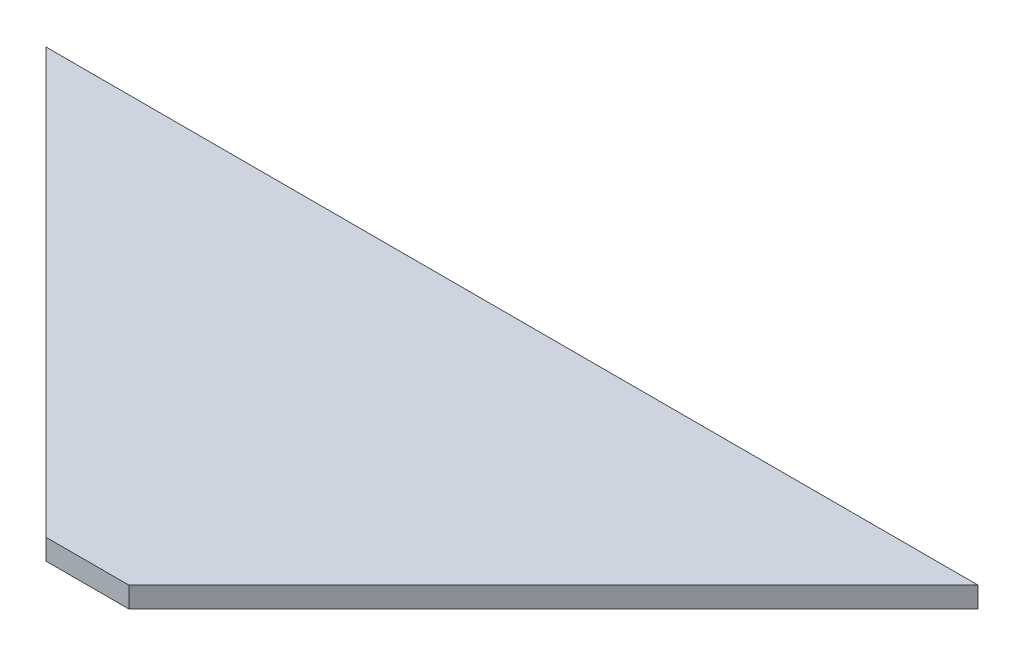
ISO-10303-21;
HEADER;
FILE_DESCRIPTION(('STEP AP214'),'2;1');
FILE_NAME('part.step','',(''),(''),'','','');
FILE_SCHEMA(('AUTOMOTIVE_DESIGN { 1 0 10303 214 1 1 1 1 }'));
ENDSEC;
DATA;
#1=APPLICATION_CONTEXT('core data for automotive mechanical design processes');
#2=APPLICATION_PROTOCOL_DEFINITION('international standard','automotive_design',2000,#1);
#3=PRODUCT_CONTEXT('',#1,'mechanical');
#4=PRODUCT('Part','Part','',(#3));
#5=PRODUCT_RELATED_PRODUCT_CATEGORY('part','',(#4));
#6=PRODUCT_DEFINITION_FORMATION('','',#4);
#7=PRODUCT_DEFINITION_CONTEXT('part definition',#1,'design');
#8=PRODUCT_DEFINITION('design','',#6,#7);
#9=PRODUCT_DEFINITION_SHAPE('','',#8);
#10=(LENGTH_UNIT() NAMED_UNIT(*) SI_UNIT(.MILLI.,.METRE.));
#11=(NAMED_UNIT(*) PLANE_ANGLE_UNIT() SI_UNIT($,.RADIAN.));
#12=(NAMED_UNIT(*) SI_UNIT($,.STERADIAN.) SOLID_ANGLE_UNIT());
#13=UNCERTAINTY_MEASURE_WITH_UNIT(LENGTH_MEASURE(1.E-05),#10,'distance_accuracy_value','');
#14=(GEOMETRIC_REPRESENTATION_CONTEXT(3) GLOBAL_UNCERTAINTY_ASSIGNED_CONTEXT((#13)) GLOBAL_UNIT_ASSIGNED_CONTEXT((#10,
#11,#12)) REPRESENTATION_CONTEXT('',''));
#15=CARTESIAN_POINT('',(0.,0.,0.));
#16=DIRECTION('',(0.,0.,1.));
#17=DIRECTION('',(1.,0.,0.));
#18=AXIS2_PLACEMENT_3D('',#15,#16,#17);
#19=CARTESIAN_POINT('',(-1.99999999999989,1.,-1.99999999999987));
#20=DIRECTION('',(0.707106781186544,0.,-0.707106781186551));
#21=DIRECTION('',(-0.707106781186551,0.,-0.707106781186544));
#22=AXIS2_PLACEMENT_3D('',#19,#20,#21);
#23=PLANE('',#22);
#24=DIRECTION('',(0.707106781186551,0.,0.707106781186544));
#25=VECTOR('',#24,1.);
#26=CARTESIAN_POINT('',(-1.99999999999989,0.,-1.99999999999987));
#27=LINE('',#26,#25);
#28=CARTESIAN_POINT('',(-22.5,0.,-22.4999999999998));
#29=VERTEX_POINT('',#28);
#30=CARTESIAN_POINT('',(-1.99999999999989,0.,-1.99999999999987));
#31=VERTEX_POINT('',#30);
#32=EDGE_CURVE('E100',#29,#31,#27,.T.);
#33=ORIENTED_EDGE('',*,*,#32,.T.);
#34=DIRECTION('',(0.,-1.,0.));
#35=VECTOR('',#34,1.);
#36=CARTESIAN_POINT('',(-1.99999999999989,1.,-1.99999999999987));
#37=LINE('',#36,#35);
#38=CARTESIAN_POINT('',(-1.99999999999989,1.,-1.99999999999987));
#39=VERTEX_POINT('',#38);
#40=EDGE_CURVE('E11',#39,#31,#37,.T.);
#41=ORIENTED_EDGE('',*,*,#40,.F.);
#42=DIRECTION('',(0.707106781186551,0.,0.707106781186544));
#43=VECTOR('',#42,1.);
#44=CARTESIAN_POINT('',(-1.99999999999989,1.,-1.99999999999987));
#45=LINE('',#44,#43);
#46=CARTESIAN_POINT('',(-22.5,1.,-22.4999999999998));
#47=VERTEX_POINT('',#46);
#48=EDGE_CURVE('E87',#47,#39,#45,.T.);
#49=ORIENTED_EDGE('',*,*,#48,.F.);
#50=DIRECTION('',(0.,-1.,0.));
#51=VECTOR('',#50,1.);
#52=CARTESIAN_POINT('',(-22.5,1.,-22.4999999999998));
#53=LINE('',#52,#51);
#54=EDGE_CURVE('E96',#47,#29,#53,.T.);
#55=ORIENTED_EDGE('',*,*,#54,.T.);
#56=EDGE_LOOP('',(#33,#41,#49,#55));
#57=FACE_BOUND('',#56,.T.);
#58=ADVANCED_FACE('F36',(#57),#23,.F.);
#59=CARTESIAN_POINT('',(1.99999999999989,1.,-1.99999999999987));
#60=DIRECTION('',(0.,0.,-1.));
#61=DIRECTION('',(-1.,0.,0.));
#62=AXIS2_PLACEMENT_3D('',#59,#60,#61);
#63=PLANE('',#62);
#64=DIRECTION('',(1.,0.,0.));
#65=VECTOR('',#64,1.);
#66=CARTESIAN_POINT('',(1.99999999999989,0.,-1.99999999999987));
#67=LINE('',#66,#65);
#68=CARTESIAN_POINT('',(1.99999999999989,0.,-1.99999999999987));
#69=VERTEX_POINT('',#68);
#70=EDGE_CURVE('E91',#31,#69,#67,.T.);
#71=ORIENTED_EDGE('',*,*,#70,.T.);
#72=DIRECTION('',(0.,-1.,0.));
#73=VECTOR('',#72,1.);
#74=CARTESIAN_POINT('',(1.99999999999989,1.,-1.99999999999987));
#75=LINE('',#74,#73);
#76=CARTESIAN_POINT('',(1.99999999999989,1.,-1.99999999999987));
#77=VERTEX_POINT('',#76);
#78=EDGE_CURVE('E44',#77,#69,#75,.T.);
#79=ORIENTED_EDGE('',*,*,#78,.F.);
#80=DIRECTION('',(1.,0.,0.));
#81=VECTOR('',#80,1.);
#82=CARTESIAN_POINT('',(1.99999999999989,1.,-1.99999999999987));
#83=LINE('',#82,#81);
#84=EDGE_CURVE('E82',#39,#77,#83,.T.);
#85=ORIENTED_EDGE('',*,*,#84,.F.);
#86=ORIENTED_EDGE('',*,*,#40,.T.);
#87=EDGE_LOOP('',(#71,#79,#85,#86));
#88=FACE_BOUND('',#87,.T.);
#89=ADVANCED_FACE('F90',(#88),#63,.F.);
#90=CARTESIAN_POINT('',(22.5,1.,-22.4999999999998));
#91=DIRECTION('',(-0.707106781186544,0.,-0.707106781186551));
#92=DIRECTION('',(-0.707106781186551,0.,0.707106781186544));
#93=AXIS2_PLACEMENT_3D('',#90,#91,#92);
#94=PLANE('',#93);
#95=DIRECTION('',(0.707106781186551,0.,-0.707106781186544));
#96=VECTOR('',#95,1.);
#97=CARTESIAN_POINT('',(22.5,0.,-22.4999999999998));
#98=LINE('',#97,#96);
#99=CARTESIAN_POINT('',(22.5,0.,-22.4999999999998));
#100=VERTEX_POINT('',#99);
#101=EDGE_CURVE('E69',#69,#100,#98,.T.);
#102=ORIENTED_EDGE('',*,*,#101,.T.);
#103=DIRECTION('',(0.,-1.,0.));
#104=VECTOR('',#103,1.);
#105=CARTESIAN_POINT('',(22.5,1.,-22.4999999999998));
#106=LINE('',#105,#104);
#107=CARTESIAN_POINT('',(22.5,1.,-22.4999999999998));
#108=VERTEX_POINT('',#107);
#109=EDGE_CURVE('E92',#108,#100,#106,.T.);
#110=ORIENTED_EDGE('',*,*,#109,.F.);
#111=DIRECTION('',(0.707106781186551,0.,-0.707106781186544));
#112=VECTOR('',#111,1.);
#113=CARTESIAN_POINT('',(22.5,1.,-22.4999999999998));
#114=LINE('',#113,#112);
#115=EDGE_CURVE('E85',#77,#108,#114,.T.);
#116=ORIENTED_EDGE('',*,*,#115,.F.);
#117=ORIENTED_EDGE('',*,*,#78,.T.);
#118=EDGE_LOOP('',(#102,#110,#116,#117));
#119=FACE_BOUND('',#118,.T.);
#120=ADVANCED_FACE('F93',(#119),#94,.F.);
#121=CARTESIAN_POINT('',(-22.5,1.,-22.4999999999998));
#122=DIRECTION('',(0.,0.,1.));
#123=DIRECTION('',(1.,0.,0.));
#124=AXIS2_PLACEMENT_3D('',#121,#122,#123);
#125=PLANE('',#124);
#126=DIRECTION('',(-1.,0.,0.));
#127=VECTOR('',#126,1.);
#128=CARTESIAN_POINT('',(-22.5,0.,-22.4999999999998));
#129=LINE('',#128,#127);
#130=EDGE_CURVE('E75',#100,#29,#129,.T.);
#131=ORIENTED_EDGE('',*,*,#130,.T.);
#132=ORIENTED_EDGE('',*,*,#54,.F.);
#133=DIRECTION('',(-1.,0.,0.));
#134=VECTOR('',#133,1.);
#135=CARTESIAN_POINT('',(-22.5,1.,-22.4999999999998));
#136=LINE('',#135,#134);
#137=EDGE_CURVE('E52',#108,#47,#136,.T.);
#138=ORIENTED_EDGE('',*,*,#137,.F.);
#139=ORIENTED_EDGE('',*,*,#109,.T.);
#140=EDGE_LOOP('',(#131,#132,#138,#139));
#141=FACE_BOUND('',#140,.T.);
#142=ADVANCED_FACE('F107',(#141),#125,.F.);
#143=CARTESIAN_POINT('',(0.,1.,0.));
#144=DIRECTION('',(0.,1.,0.));
#145=DIRECTION('',(0.,0.,1.));
#146=AXIS2_PLACEMENT_3D('',#143,#144,#145);
#147=PLANE('',#146);
#148=ORIENTED_EDGE('',*,*,#48,.T.);
#149=ORIENTED_EDGE('',*,*,#84,.T.);
#150=ORIENTED_EDGE('',*,*,#115,.T.);
#151=ORIENTED_EDGE('',*,*,#137,.T.);
#152=EDGE_LOOP('',(#148,#149,#150,#151));
#153=FACE_BOUND('',#152,.T.);
#154=ADVANCED_FACE('F83',(#153),#147,.T.);
#155=CARTESIAN_POINT('',(0.,0.,0.));
#156=DIRECTION('',(0.,1.,0.));
#157=DIRECTION('',(0.,0.,1.));
#158=AXIS2_PLACEMENT_3D('',#155,#156,#157);
#159=PLANE('',#158);
#160=ORIENTED_EDGE('',*,*,#32,.F.);
#161=ORIENTED_EDGE('',*,*,#130,.F.);
#162=ORIENTED_EDGE('',*,*,#101,.F.);
#163=ORIENTED_EDGE('',*,*,#70,.F.);
#164=EDGE_LOOP('',(#160,#161,#162,#163));
#165=FACE_BOUND('',#164,.T.);
#166=ADVANCED_FACE('F110',(#165),#159,.F.);
#167=CLOSED_SHELL('',(#58,#89,#120,#142,#154,#166));
#168=MANIFOLD_SOLID_BREP('B2',#167);
#169=ADVANCED_BREP_SHAPE_REPRESENTATION('',(#18,#168),#14);
#170=SHAPE_DEFINITION_REPRESENTATION(#9,#169);
ENDSEC;
END-ISO-10303-21;
